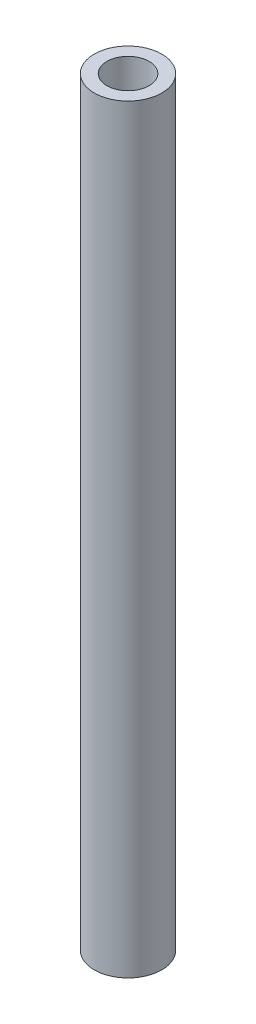
ISO-10303-21;
HEADER;
FILE_DESCRIPTION(('STEP AP214'),'2;1');
FILE_NAME('part.step','',(''),(''),'','','');
FILE_SCHEMA(('AUTOMOTIVE_DESIGN { 1 0 10303 214 1 1 1 1 }'));
ENDSEC;
DATA;
#1=APPLICATION_CONTEXT('core data for automotive mechanical design processes');
#2=APPLICATION_PROTOCOL_DEFINITION('international standard','automotive_design',2000,#1);
#3=PRODUCT_CONTEXT('',#1,'mechanical');
#4=PRODUCT('Part','Part','',(#3));
#5=PRODUCT_RELATED_PRODUCT_CATEGORY('part','',(#4));
#6=PRODUCT_DEFINITION_FORMATION('','',#4);
#7=PRODUCT_DEFINITION_CONTEXT('part definition',#1,'design');
#8=PRODUCT_DEFINITION('design','',#6,#7);
#9=PRODUCT_DEFINITION_SHAPE('','',#8);
#10=(LENGTH_UNIT() NAMED_UNIT(*) SI_UNIT(.MILLI.,.METRE.));
#11=(NAMED_UNIT(*) PLANE_ANGLE_UNIT() SI_UNIT($,.RADIAN.));
#12=(NAMED_UNIT(*) SI_UNIT($,.STERADIAN.) SOLID_ANGLE_UNIT());
#13=UNCERTAINTY_MEASURE_WITH_UNIT(LENGTH_MEASURE(1.E-05),#10,'distance_accuracy_value','');
#14=(GEOMETRIC_REPRESENTATION_CONTEXT(3) GLOBAL_UNCERTAINTY_ASSIGNED_CONTEXT((#13)) GLOBAL_UNIT_ASSIGNED_CONTEXT((#10,
#11,#12)) REPRESENTATION_CONTEXT('',''));
#15=CARTESIAN_POINT('',(0.,0.,0.));
#16=DIRECTION('',(0.,0.,1.));
#17=DIRECTION('',(1.,0.,0.));
#18=AXIS2_PLACEMENT_3D('',#15,#16,#17);
#19=CARTESIAN_POINT('',(0.,90.,0.));
#20=DIRECTION('',(0.,1.,0.));
#21=DIRECTION('',(0.,0.,1.));
#22=AXIS2_PLACEMENT_3D('',#19,#20,#21);
#23=PLANE('',#22);
#24=CARTESIAN_POINT('',(0.,90.,0.));
#25=DIRECTION('',(0.,1.,0.));
#26=DIRECTION('',(0.,0.,1.));
#27=AXIS2_PLACEMENT_3D('',#24,#25,#26);
#28=CIRCLE('',#27,4.);
#29=CARTESIAN_POINT('',(0.,90.,-4.));
#30=VERTEX_POINT('',#29);
#31=EDGE_CURVE('E10',#30,#30,#28,.T.);
#32=ORIENTED_EDGE('',*,*,#31,.T.);
#33=EDGE_LOOP('',(#32));
#34=FACE_BOUND('',#33,.T.);
#35=CARTESIAN_POINT('',(0.,90.,0.));
#36=DIRECTION('',(0.,1.,0.));
#37=DIRECTION('',(0.,0.,1.));
#38=AXIS2_PLACEMENT_3D('',#35,#36,#37);
#39=CIRCLE('',#38,2.5);
#40=CARTESIAN_POINT('',(0.,90.,-2.5));
#41=VERTEX_POINT('',#40);
#42=EDGE_CURVE('E50',#41,#41,#39,.T.);
#43=ORIENTED_EDGE('',*,*,#42,.F.);
#44=EDGE_LOOP('',(#43));
#45=FACE_BOUND('',#44,.T.);
#46=ADVANCED_FACE('F37',(#34,#45),#23,.T.);
#47=CARTESIAN_POINT('',(0.,0.,0.));
#48=DIRECTION('',(0.,1.,0.));
#49=DIRECTION('',(0.,0.,1.));
#50=AXIS2_PLACEMENT_3D('',#47,#48,#49);
#51=PLANE('',#50);
#52=CARTESIAN_POINT('',(0.,0.,0.));
#53=DIRECTION('',(0.,1.,0.));
#54=DIRECTION('',(0.,0.,1.));
#55=AXIS2_PLACEMENT_3D('',#52,#53,#54);
#56=CIRCLE('',#55,4.);
#57=CARTESIAN_POINT('',(0.,0.,-4.));
#58=VERTEX_POINT('',#57);
#59=EDGE_CURVE('E41',#58,#58,#56,.T.);
#60=ORIENTED_EDGE('',*,*,#59,.F.);
#61=EDGE_LOOP('',(#60));
#62=FACE_BOUND('',#61,.T.);
#63=CARTESIAN_POINT('',(0.,0.,0.));
#64=DIRECTION('',(0.,1.,0.));
#65=DIRECTION('',(0.,0.,1.));
#66=AXIS2_PLACEMENT_3D('',#63,#64,#65);
#67=CIRCLE('',#66,2.5);
#68=CARTESIAN_POINT('',(0.,0.,-2.5));
#69=VERTEX_POINT('',#68);
#70=EDGE_CURVE('E52',#69,#69,#67,.T.);
#71=ORIENTED_EDGE('',*,*,#70,.T.);
#72=EDGE_LOOP('',(#71));
#73=FACE_BOUND('',#72,.T.);
#74=ADVANCED_FACE('F64',(#62,#73),#51,.F.);
#75=CARTESIAN_POINT('',(0.,90.,0.));
#76=DIRECTION('',(0.,-1.,0.));
#77=DIRECTION('',(0.,0.,-1.));
#78=AXIS2_PLACEMENT_3D('',#75,#76,#77);
#79=CYLINDRICAL_SURFACE('',#78,4.);
#80=CARTESIAN_POINT('',(0.,90.,-4.));
#81=CARTESIAN_POINT('',(0.,89.0625,-4.));
#82=CARTESIAN_POINT('',(0.,88.125,-4.));
#83=CARTESIAN_POINT('',(0.,86.25,-4.));
#84=CARTESIAN_POINT('',(0.,85.3125,-4.));
#85=CARTESIAN_POINT('',(0.,83.4375,-4.));
#86=CARTESIAN_POINT('',(0.,82.5,-4.));
#87=CARTESIAN_POINT('',(0.,80.625,-4.));
#88=CARTESIAN_POINT('',(0.,79.6875,-4.));
#89=CARTESIAN_POINT('',(0.,77.8125,-4.));
#90=CARTESIAN_POINT('',(0.,76.875,-4.));
#91=CARTESIAN_POINT('',(0.,75.,-4.));
#92=CARTESIAN_POINT('',(0.,74.0625,-4.));
#93=CARTESIAN_POINT('',(0.,72.1875,-4.));
#94=CARTESIAN_POINT('',(0.,71.25,-4.));
#95=CARTESIAN_POINT('',(0.,69.375,-4.));
#96=CARTESIAN_POINT('',(0.,68.4375,-4.));
#97=CARTESIAN_POINT('',(0.,66.5625,-4.));
#98=CARTESIAN_POINT('',(0.,65.625,-4.));
#99=CARTESIAN_POINT('',(0.,63.75,-4.));
#100=CARTESIAN_POINT('',(0.,62.8125,-4.));
#101=CARTESIAN_POINT('',(0.,60.9375,-4.));
#102=CARTESIAN_POINT('',(0.,60.,-4.));
#103=CARTESIAN_POINT('',(0.,58.125,-4.));
#104=CARTESIAN_POINT('',(0.,57.1875,-4.));
#105=CARTESIAN_POINT('',(0.,55.3125,-4.));
#106=CARTESIAN_POINT('',(0.,54.375,-4.));
#107=CARTESIAN_POINT('',(0.,52.5,-4.));
#108=CARTESIAN_POINT('',(0.,51.5625,-4.));
#109=CARTESIAN_POINT('',(0.,49.6875,-4.));
#110=CARTESIAN_POINT('',(0.,48.75,-4.));
#111=CARTESIAN_POINT('',(0.,46.875,-4.));
#112=CARTESIAN_POINT('',(0.,45.9375,-4.));
#113=CARTESIAN_POINT('',(0.,44.0625,-4.));
#114=CARTESIAN_POINT('',(0.,43.125,-4.));
#115=CARTESIAN_POINT('',(0.,41.25,-4.));
#116=CARTESIAN_POINT('',(0.,40.3125,-4.));
#117=CARTESIAN_POINT('',(0.,38.4375,-4.));
#118=CARTESIAN_POINT('',(0.,37.5,-4.));
#119=CARTESIAN_POINT('',(0.,35.625,-4.));
#120=CARTESIAN_POINT('',(0.,34.6875,-4.));
#121=CARTESIAN_POINT('',(0.,32.8125,-4.));
#122=CARTESIAN_POINT('',(0.,31.875,-4.));
#123=CARTESIAN_POINT('',(0.,30.,-4.));
#124=CARTESIAN_POINT('',(0.,29.0625,-4.));
#125=CARTESIAN_POINT('',(0.,27.1875,-4.));
#126=CARTESIAN_POINT('',(0.,26.25,-4.));
#127=CARTESIAN_POINT('',(0.,24.375,-4.));
#128=CARTESIAN_POINT('',(0.,23.4375,-4.));
#129=CARTESIAN_POINT('',(0.,21.5625,-4.));
#130=CARTESIAN_POINT('',(0.,20.625,-4.));
#131=CARTESIAN_POINT('',(0.,18.75,-4.));
#132=CARTESIAN_POINT('',(0.,17.8125,-4.));
#133=CARTESIAN_POINT('',(0.,15.9375,-4.));
#134=CARTESIAN_POINT('',(0.,15.,-4.));
#135=CARTESIAN_POINT('',(0.,13.125,-4.));
#136=CARTESIAN_POINT('',(0.,12.1875,-4.));
#137=CARTESIAN_POINT('',(0.,10.3125,-4.));
#138=CARTESIAN_POINT('',(0.,9.37499999999999,-4.));
#139=CARTESIAN_POINT('',(0.,7.49999999999999,-4.));
#140=CARTESIAN_POINT('',(0.,6.56249999999999,-4.));
#141=CARTESIAN_POINT('',(0.,4.68749999999999,-4.));
#142=CARTESIAN_POINT('',(0.,3.74999999999998,-4.));
#143=CARTESIAN_POINT('',(0.,1.87499999999998,-4.));
#144=CARTESIAN_POINT('',(0.,0.937499999999986,-4.));
#145=CARTESIAN_POINT('',(0.,0.,-4.));
#146=B_SPLINE_CURVE_WITH_KNOTS('',3,(#80,#81,#82,#83,#84,#85,#86,#87,#88,#89,#90,#91,#92,#93,
#94,#95,#96,#97,#98,#99,#100,#101,#102,#103,#104,#105,#106,#107,#108,#109,#110,#111,#112,#113,
#114,#115,#116,#117,#118,#119,#120,#121,#122,#123,#124,#125,#126,#127,#128,#129,#130,#131,#132,
#133,#134,#135,#136,#137,#138,#139,#140,#141,#142,#143,#144,#145),.UNSPECIFIED.,.F.,.F.,(4,2,2,
2,2,2,2,2,2,2,2,2,2,2,2,2,2,2,2,2,2,2,2,2,2,2,2,2,2,2,2,2,4),(0.,2.8125,5.62499999999999,
8.43749999999999,11.25,14.0625,16.875,19.6875,22.5,25.3125,28.125,30.9375,33.75,36.5625,39.375,
42.1875,45.,47.8125,50.625,53.4375,56.25,59.0625,61.875,64.6875,67.5,70.3125,73.125,75.9375,
78.75,81.5625,84.375,87.1875,90.),.UNSPECIFIED.);
#147=EDGE_CURVE('BSEAM39',#30,#58,#146,.T.);
#148=ORIENTED_EDGE('',*,*,#31,.F.);
#149=ORIENTED_EDGE('',*,*,#59,.T.);
#150=ORIENTED_EDGE('',*,*,#147,.T.);
#151=ORIENTED_EDGE('',*,*,#147,.F.);
#152=EDGE_LOOP('',(#148,#150,#149,#151));
#153=FACE_BOUND('',#152,.T.);
#154=ADVANCED_FACE('F39',(#153),#79,.T.);
#155=CARTESIAN_POINT('',(0.,90.,0.));
#156=DIRECTION('',(0.,-1.,0.));
#157=DIRECTION('',(0.,0.,-1.));
#158=AXIS2_PLACEMENT_3D('',#155,#156,#157);
#159=CYLINDRICAL_SURFACE('',#158,2.5);
#160=CARTESIAN_POINT('',(0.,90.,-2.5));
#161=CARTESIAN_POINT('',(0.,89.0625,-2.5));
#162=CARTESIAN_POINT('',(0.,88.125,-2.5));
#163=CARTESIAN_POINT('',(0.,86.25,-2.5));
#164=CARTESIAN_POINT('',(0.,85.3125,-2.5));
#165=CARTESIAN_POINT('',(0.,83.4375,-2.5));
#166=CARTESIAN_POINT('',(0.,82.5,-2.5));
#167=CARTESIAN_POINT('',(0.,80.625,-2.5));
#168=CARTESIAN_POINT('',(0.,79.6875,-2.5));
#169=CARTESIAN_POINT('',(0.,77.8125,-2.5));
#170=CARTESIAN_POINT('',(0.,76.875,-2.5));
#171=CARTESIAN_POINT('',(0.,75.,-2.5));
#172=CARTESIAN_POINT('',(0.,74.0625,-2.5));
#173=CARTESIAN_POINT('',(0.,72.1875,-2.5));
#174=CARTESIAN_POINT('',(0.,71.25,-2.5));
#175=CARTESIAN_POINT('',(0.,69.375,-2.5));
#176=CARTESIAN_POINT('',(0.,68.4375,-2.5));
#177=CARTESIAN_POINT('',(0.,66.5625,-2.5));
#178=CARTESIAN_POINT('',(0.,65.625,-2.5));
#179=CARTESIAN_POINT('',(0.,63.75,-2.5));
#180=CARTESIAN_POINT('',(0.,62.8125,-2.5));
#181=CARTESIAN_POINT('',(0.,60.9375,-2.5));
#182=CARTESIAN_POINT('',(0.,60.,-2.5));
#183=CARTESIAN_POINT('',(0.,58.125,-2.5));
#184=CARTESIAN_POINT('',(0.,57.1875,-2.5));
#185=CARTESIAN_POINT('',(0.,55.3125,-2.5));
#186=CARTESIAN_POINT('',(0.,54.375,-2.5));
#187=CARTESIAN_POINT('',(0.,52.5,-2.5));
#188=CARTESIAN_POINT('',(0.,51.5625,-2.5));
#189=CARTESIAN_POINT('',(0.,49.6875,-2.5));
#190=CARTESIAN_POINT('',(0.,48.75,-2.5));
#191=CARTESIAN_POINT('',(0.,46.875,-2.5));
#192=CARTESIAN_POINT('',(0.,45.9375,-2.5));
#193=CARTESIAN_POINT('',(0.,44.0625,-2.5));
#194=CARTESIAN_POINT('',(0.,43.125,-2.5));
#195=CARTESIAN_POINT('',(0.,41.25,-2.5));
#196=CARTESIAN_POINT('',(0.,40.3125,-2.5));
#197=CARTESIAN_POINT('',(0.,38.4375,-2.5));
#198=CARTESIAN_POINT('',(0.,37.5,-2.5));
#199=CARTESIAN_POINT('',(0.,35.625,-2.5));
#200=CARTESIAN_POINT('',(0.,34.6875,-2.5));
#201=CARTESIAN_POINT('',(0.,32.8125,-2.5));
#202=CARTESIAN_POINT('',(0.,31.875,-2.5));
#203=CARTESIAN_POINT('',(0.,30.,-2.5));
#204=CARTESIAN_POINT('',(0.,29.0625,-2.5));
#205=CARTESIAN_POINT('',(0.,27.1875,-2.5));
#206=CARTESIAN_POINT('',(0.,26.25,-2.5));
#207=CARTESIAN_POINT('',(0.,24.375,-2.5));
#208=CARTESIAN_POINT('',(0.,23.4375,-2.5));
#209=CARTESIAN_POINT('',(0.,21.5625,-2.5));
#210=CARTESIAN_POINT('',(0.,20.625,-2.5));
#211=CARTESIAN_POINT('',(0.,18.75,-2.5));
#212=CARTESIAN_POINT('',(0.,17.8125,-2.5));
#213=CARTESIAN_POINT('',(0.,15.9375,-2.5));
#214=CARTESIAN_POINT('',(0.,15.,-2.5));
#215=CARTESIAN_POINT('',(0.,13.125,-2.5));
#216=CARTESIAN_POINT('',(0.,12.1875,-2.5));
#217=CARTESIAN_POINT('',(0.,10.3125,-2.5));
#218=CARTESIAN_POINT('',(0.,9.37499999999999,-2.5));
#219=CARTESIAN_POINT('',(0.,7.49999999999999,-2.5));
#220=CARTESIAN_POINT('',(0.,6.56249999999999,-2.5));
#221=CARTESIAN_POINT('',(0.,4.68749999999999,-2.5));
#222=CARTESIAN_POINT('',(0.,3.74999999999998,-2.5));
#223=CARTESIAN_POINT('',(0.,1.87499999999998,-2.5));
#224=CARTESIAN_POINT('',(0.,0.937499999999986,-2.5));
#225=CARTESIAN_POINT('',(0.,0.,-2.5));
#226=B_SPLINE_CURVE_WITH_KNOTS('',3,(#160,#161,#162,#163,#164,#165,#166,#167,#168,#169,#170,
#171,#172,#173,#174,#175,#176,#177,#178,#179,#180,#181,#182,#183,#184,#185,#186,#187,#188,#189,
#190,#191,#192,#193,#194,#195,#196,#197,#198,#199,#200,#201,#202,#203,#204,#205,#206,#207,#208,
#209,#210,#211,#212,#213,#214,#215,#216,#217,#218,#219,#220,#221,#222,#223,#224,#225),
.UNSPECIFIED.,.F.,.F.,(4,2,2,2,2,2,2,2,2,2,2,2,2,2,2,2,2,2,2,2,2,2,2,2,2,2,2,2,2,2,2,2,4),(0.,
2.81250000000001,5.62500000000001,8.43750000000001,11.25,14.0625,16.875,19.6875,22.5,25.3125,
28.125,30.9375,33.75,36.5625,39.375,42.1875,45.,47.8125,50.625,53.4375,56.25,59.0625,61.875,
64.6875,67.5,70.3125,73.125,75.9375,78.75,81.5625,84.375,87.1875,90.),.UNSPECIFIED.);
#227=EDGE_CURVE('BSEAM60',#41,#69,#226,.T.);
#228=ORIENTED_EDGE('',*,*,#42,.T.);
#229=ORIENTED_EDGE('',*,*,#70,.F.);
#230=ORIENTED_EDGE('',*,*,#227,.T.);
#231=ORIENTED_EDGE('',*,*,#227,.F.);
#232=EDGE_LOOP('',(#228,#230,#229,#231));
#233=FACE_BOUND('',#232,.T.);
#234=ADVANCED_FACE('F60',(#233),#159,.F.);
#235=CLOSED_SHELL('',(#46,#74,#154,#234));
#236=MANIFOLD_SOLID_BREP('B2',#235);
#237=ADVANCED_BREP_SHAPE_REPRESENTATION('',(#18,#236),#14);
#238=SHAPE_DEFINITION_REPRESENTATION(#9,#237);
ENDSEC;
END-ISO-10303-21;
